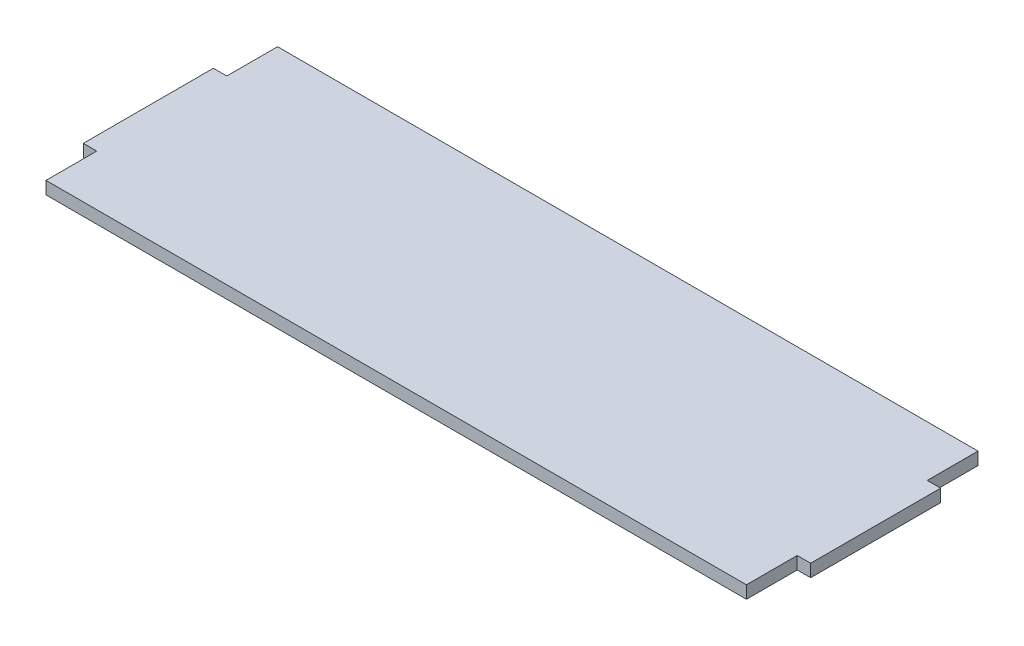
ISO-10303-21;
HEADER;
FILE_DESCRIPTION(('STEP AP214'),'2;1');
FILE_NAME('part.step','',(''),(''),'','','');
FILE_SCHEMA(('AUTOMOTIVE_DESIGN { 1 0 10303 214 1 1 1 1 }'));
ENDSEC;
DATA;
#1=APPLICATION_CONTEXT('core data for automotive mechanical design processes');
#2=APPLICATION_PROTOCOL_DEFINITION('international standard','automotive_design',2000,#1);
#3=PRODUCT_CONTEXT('',#1,'mechanical');
#4=PRODUCT('Part','Part','',(#3));
#5=PRODUCT_RELATED_PRODUCT_CATEGORY('part','',(#4));
#6=PRODUCT_DEFINITION_FORMATION('','',#4);
#7=PRODUCT_DEFINITION_CONTEXT('part definition',#1,'design');
#8=PRODUCT_DEFINITION('design','',#6,#7);
#9=PRODUCT_DEFINITION_SHAPE('','',#8);
#10=(LENGTH_UNIT() NAMED_UNIT(*) SI_UNIT(.MILLI.,.METRE.));
#11=(NAMED_UNIT(*) PLANE_ANGLE_UNIT() SI_UNIT($,.RADIAN.));
#12=(NAMED_UNIT(*) SI_UNIT($,.STERADIAN.) SOLID_ANGLE_UNIT());
#13=UNCERTAINTY_MEASURE_WITH_UNIT(LENGTH_MEASURE(1.E-05),#10,'distance_accuracy_value','');
#14=(GEOMETRIC_REPRESENTATION_CONTEXT(3) GLOBAL_UNCERTAINTY_ASSIGNED_CONTEXT((#13)) GLOBAL_UNIT_ASSIGNED_CONTEXT((#10,
#11,#12)) REPRESENTATION_CONTEXT('',''));
#15=CARTESIAN_POINT('',(0.,0.,0.));
#16=DIRECTION('',(0.,0.,1.));
#17=DIRECTION('',(1.,0.,0.));
#18=AXIS2_PLACEMENT_3D('',#15,#16,#17);
#19=CARTESIAN_POINT('',(-520.4714,234.892997883358,228.4222));
#20=DIRECTION('',(-1.,0.,0.));
#21=DIRECTION('',(0.,0.,1.));
#22=AXIS2_PLACEMENT_3D('',#19,#20,#21);
#23=PLANE('',#22);
#24=DIRECTION('',(0.,0.,-1.));
#25=VECTOR('',#24,1.);
#26=CARTESIAN_POINT('',(-520.4714,3.81000000000001,228.4222));
#27=LINE('',#26,#25);
#28=CARTESIAN_POINT('',(-520.4714,3.81000000000001,243.7892));
#29=VERTEX_POINT('',#28);
#30=CARTESIAN_POINT('',(-520.4714,3.81000000000006,228.4222));
#31=VERTEX_POINT('',#30);
#32=EDGE_CURVE('E170',#29,#31,#27,.T.);
#33=ORIENTED_EDGE('',*,*,#32,.F.);
#34=DIRECTION('',(0.,-1.,0.));
#35=VECTOR('',#34,1.);
#36=CARTESIAN_POINT('',(-520.4714,234.892997883358,243.7892));
#37=LINE('',#36,#35);
#38=CARTESIAN_POINT('',(-520.4714,0.,243.7892));
#39=VERTEX_POINT('',#38);
#40=EDGE_CURVE('E39',#29,#39,#37,.T.);
#41=ORIENTED_EDGE('',*,*,#40,.T.);
#42=DIRECTION('',(0.,0.,-1.));
#43=VECTOR('',#42,1.);
#44=CARTESIAN_POINT('',(-520.4714,0.,228.4222));
#45=LINE('',#44,#43);
#46=CARTESIAN_POINT('',(-520.4714,0.,228.4222));
#47=VERTEX_POINT('',#46);
#48=EDGE_CURVE('E178',#39,#47,#45,.T.);
#49=ORIENTED_EDGE('',*,*,#48,.T.);
#50=DIRECTION('',(0.,-1.,0.));
#51=VECTOR('',#50,1.);
#52=CARTESIAN_POINT('',(-520.4714,234.892997883358,228.4222));
#53=LINE('',#52,#51);
#54=EDGE_CURVE('E106',#31,#47,#53,.T.);
#55=ORIENTED_EDGE('',*,*,#54,.F.);
#56=EDGE_LOOP('',(#33,#41,#49,#55));
#57=FACE_BOUND('',#56,.T.);
#58=ADVANCED_FACE('F35',(#57),#23,.F.);
#59=CARTESIAN_POINT('',(-516.4074,234.892997883358,228.4222));
#60=DIRECTION('',(0.,0.,-1.));
#61=DIRECTION('',(-1.,0.,0.));
#62=AXIS2_PLACEMENT_3D('',#59,#60,#61);
#63=PLANE('',#62);
#64=DIRECTION('',(1.,0.,0.));
#65=VECTOR('',#64,1.);
#66=CARTESIAN_POINT('',(-516.4074,3.81000000000001,228.4222));
#67=LINE('',#66,#65);
#68=CARTESIAN_POINT('',(-516.4074,3.81000000000006,228.4222));
#69=VERTEX_POINT('',#68);
#70=EDGE_CURVE('E113',#31,#69,#67,.T.);
#71=ORIENTED_EDGE('',*,*,#70,.F.);
#72=ORIENTED_EDGE('',*,*,#54,.T.);
#73=DIRECTION('',(1.,0.,0.));
#74=VECTOR('',#73,1.);
#75=CARTESIAN_POINT('',(-516.4074,0.,228.4222));
#76=LINE('',#75,#74);
#77=CARTESIAN_POINT('',(-516.4074,0.,228.4222));
#78=VERTEX_POINT('',#77);
#79=EDGE_CURVE('E177',#47,#78,#76,.T.);
#80=ORIENTED_EDGE('',*,*,#79,.T.);
#81=DIRECTION('',(0.,-1.,0.));
#82=VECTOR('',#81,1.);
#83=CARTESIAN_POINT('',(-516.4074,234.892997883358,228.4222));
#84=LINE('',#83,#82);
#85=EDGE_CURVE('E179',#69,#78,#84,.T.);
#86=ORIENTED_EDGE('',*,*,#85,.F.);
#87=EDGE_LOOP('',(#71,#72,#80,#86));
#88=FACE_BOUND('',#87,.T.);
#89=ADVANCED_FACE('F228',(#88),#63,.F.);
#90=CARTESIAN_POINT('',(-516.4074,234.892997883358,189.0522));
#91=DIRECTION('',(-1.,0.,0.));
#92=DIRECTION('',(0.,0.,1.));
#93=AXIS2_PLACEMENT_3D('',#90,#91,#92);
#94=PLANE('',#93);
#95=DIRECTION('',(0.,0.,-1.));
#96=VECTOR('',#95,1.);
#97=CARTESIAN_POINT('',(-516.4074,3.81000000000001,189.0522));
#98=LINE('',#97,#96);
#99=CARTESIAN_POINT('',(-516.4074,3.81000000000006,189.0522));
#100=VERTEX_POINT('',#99);
#101=EDGE_CURVE('E166',#69,#100,#98,.T.);
#102=ORIENTED_EDGE('',*,*,#101,.F.);
#103=ORIENTED_EDGE('',*,*,#85,.T.);
#104=DIRECTION('',(0.,0.,-1.));
#105=VECTOR('',#104,1.);
#106=CARTESIAN_POINT('',(-516.4074,0.,189.0522));
#107=LINE('',#106,#105);
#108=CARTESIAN_POINT('',(-516.4074,0.,189.0522));
#109=VERTEX_POINT('',#108);
#110=EDGE_CURVE('E181',#78,#109,#107,.T.);
#111=ORIENTED_EDGE('',*,*,#110,.T.);
#112=DIRECTION('',(0.,-1.,0.));
#113=VECTOR('',#112,1.);
#114=CARTESIAN_POINT('',(-516.4074,234.892997883358,189.0522));
#115=LINE('',#114,#113);
#116=EDGE_CURVE('E182',#100,#109,#115,.T.);
#117=ORIENTED_EDGE('',*,*,#116,.F.);
#118=EDGE_LOOP('',(#102,#103,#111,#117));
#119=FACE_BOUND('',#118,.T.);
#120=ADVANCED_FACE('F231',(#119),#94,.F.);
#121=CARTESIAN_POINT('',(-520.4714,234.892997883358,189.0522));
#122=DIRECTION('',(0.,0.,1.));
#123=DIRECTION('',(1.,0.,0.));
#124=AXIS2_PLACEMENT_3D('',#121,#122,#123);
#125=PLANE('',#124);
#126=DIRECTION('',(-1.,0.,0.));
#127=VECTOR('',#126,1.);
#128=CARTESIAN_POINT('',(-520.4714,3.81000000000001,189.0522));
#129=LINE('',#128,#127);
#130=CARTESIAN_POINT('',(-520.4714,3.81000000000006,189.0522));
#131=VERTEX_POINT('',#130);
#132=EDGE_CURVE('E163',#100,#131,#129,.T.);
#133=ORIENTED_EDGE('',*,*,#132,.F.);
#134=ORIENTED_EDGE('',*,*,#116,.T.);
#135=DIRECTION('',(-1.,0.,0.));
#136=VECTOR('',#135,1.);
#137=CARTESIAN_POINT('',(-520.4714,0.,189.0522));
#138=LINE('',#137,#136);
#139=CARTESIAN_POINT('',(-520.4714,0.,189.0522));
#140=VERTEX_POINT('',#139);
#141=EDGE_CURVE('E184',#109,#140,#138,.T.);
#142=ORIENTED_EDGE('',*,*,#141,.T.);
#143=DIRECTION('',(0.,-1.,0.));
#144=VECTOR('',#143,1.);
#145=CARTESIAN_POINT('',(-520.4714,234.892997883358,189.0522));
#146=LINE('',#145,#144);
#147=EDGE_CURVE('E185',#131,#140,#146,.T.);
#148=ORIENTED_EDGE('',*,*,#147,.F.);
#149=EDGE_LOOP('',(#133,#134,#142,#148));
#150=FACE_BOUND('',#149,.T.);
#151=ADVANCED_FACE('F233',(#150),#125,.F.);
#152=CARTESIAN_POINT('',(-520.4714,234.892997883358,173.6852));
#153=DIRECTION('',(-1.,0.,0.));
#154=DIRECTION('',(0.,0.,1.));
#155=AXIS2_PLACEMENT_3D('',#152,#153,#154);
#156=PLANE('',#155);
#157=DIRECTION('',(0.,0.,-1.));
#158=VECTOR('',#157,1.);
#159=CARTESIAN_POINT('',(-520.4714,3.81000000000001,173.6852));
#160=LINE('',#159,#158);
#161=CARTESIAN_POINT('',(-520.4714,3.81000000000006,173.6852));
#162=VERTEX_POINT('',#161);
#163=EDGE_CURVE('E160',#131,#162,#160,.T.);
#164=ORIENTED_EDGE('',*,*,#163,.F.);
#165=ORIENTED_EDGE('',*,*,#147,.T.);
#166=DIRECTION('',(0.,0.,-1.));
#167=VECTOR('',#166,1.);
#168=CARTESIAN_POINT('',(-520.4714,0.,173.6852));
#169=LINE('',#168,#167);
#170=CARTESIAN_POINT('',(-520.4714,0.,173.6852));
#171=VERTEX_POINT('',#170);
#172=EDGE_CURVE('E187',#140,#171,#169,.T.);
#173=ORIENTED_EDGE('',*,*,#172,.T.);
#174=DIRECTION('',(0.,-1.,0.));
#175=VECTOR('',#174,1.);
#176=CARTESIAN_POINT('',(-520.4714,234.892997883358,173.6852));
#177=LINE('',#176,#175);
#178=EDGE_CURVE('E188',#162,#171,#177,.T.);
#179=ORIENTED_EDGE('',*,*,#178,.F.);
#180=EDGE_LOOP('',(#164,#165,#173,#179));
#181=FACE_BOUND('',#180,.T.);
#182=ADVANCED_FACE('F237',(#181),#156,.F.);
#183=CARTESIAN_POINT('',(-732.536,234.892997883358,173.6852));
#184=DIRECTION('',(0.,0.,1.));
#185=DIRECTION('',(1.,0.,0.));
#186=AXIS2_PLACEMENT_3D('',#183,#184,#185);
#187=PLANE('',#186);
#188=DIRECTION('',(-1.,0.,0.));
#189=VECTOR('',#188,1.);
#190=CARTESIAN_POINT('',(-732.536,3.81000000000001,173.6852));
#191=LINE('',#190,#189);
#192=CARTESIAN_POINT('',(-732.536,3.81000000000006,173.6852));
#193=VERTEX_POINT('',#192);
#194=EDGE_CURVE('E157',#162,#193,#191,.T.);
#195=ORIENTED_EDGE('',*,*,#194,.F.);
#196=ORIENTED_EDGE('',*,*,#178,.T.);
#197=DIRECTION('',(-1.,0.,0.));
#198=VECTOR('',#197,1.);
#199=CARTESIAN_POINT('',(-732.536,0.,173.6852));
#200=LINE('',#199,#198);
#201=CARTESIAN_POINT('',(-732.536,0.,173.6852));
#202=VERTEX_POINT('',#201);
#203=EDGE_CURVE('E190',#171,#202,#200,.T.);
#204=ORIENTED_EDGE('',*,*,#203,.T.);
#205=DIRECTION('',(0.,-1.,0.));
#206=VECTOR('',#205,1.);
#207=CARTESIAN_POINT('',(-732.536,234.892997883358,173.6852));
#208=LINE('',#207,#206);
#209=EDGE_CURVE('E191',#193,#202,#208,.T.);
#210=ORIENTED_EDGE('',*,*,#209,.F.);
#211=EDGE_LOOP('',(#195,#196,#204,#210));
#212=FACE_BOUND('',#211,.T.);
#213=ADVANCED_FACE('F242',(#212),#187,.F.);
#214=CARTESIAN_POINT('',(-732.536,234.892997883358,173.6852));
#215=DIRECTION('',(1.,0.,0.));
#216=DIRECTION('',(0.,0.,-1.));
#217=AXIS2_PLACEMENT_3D('',#214,#215,#216);
#218=PLANE('',#217);
#219=DIRECTION('',(0.,0.,1.));
#220=VECTOR('',#219,1.);
#221=CARTESIAN_POINT('',(-732.536,3.81000000000001,173.6852));
#222=LINE('',#221,#220);
#223=CARTESIAN_POINT('',(-732.536,3.81000000000006,189.0522));
#224=VERTEX_POINT('',#223);
#225=EDGE_CURVE('E154',#193,#224,#222,.T.);
#226=ORIENTED_EDGE('',*,*,#225,.F.);
#227=ORIENTED_EDGE('',*,*,#209,.T.);
#228=DIRECTION('',(0.,0.,1.));
#229=VECTOR('',#228,1.);
#230=CARTESIAN_POINT('',(-732.536,0.,173.6852));
#231=LINE('',#230,#229);
#232=CARTESIAN_POINT('',(-732.536,0.,189.0522));
#233=VERTEX_POINT('',#232);
#234=EDGE_CURVE('E193',#202,#233,#231,.T.);
#235=ORIENTED_EDGE('',*,*,#234,.T.);
#236=DIRECTION('',(0.,-1.,0.));
#237=VECTOR('',#236,1.);
#238=CARTESIAN_POINT('',(-732.536,234.892997883358,189.0522));
#239=LINE('',#238,#237);
#240=EDGE_CURVE('E194',#224,#233,#239,.T.);
#241=ORIENTED_EDGE('',*,*,#240,.F.);
#242=EDGE_LOOP('',(#226,#227,#235,#241));
#243=FACE_BOUND('',#242,.T.);
#244=ADVANCED_FACE('F245',(#243),#218,.F.);
#245=CARTESIAN_POINT('',(-732.536,234.892997883358,189.0522));
#246=DIRECTION('',(0.,0.,1.));
#247=DIRECTION('',(1.,0.,0.));
#248=AXIS2_PLACEMENT_3D('',#245,#246,#247);
#249=PLANE('',#248);
#250=DIRECTION('',(-1.,0.,0.));
#251=VECTOR('',#250,1.);
#252=CARTESIAN_POINT('',(-732.536,3.81000000000001,189.0522));
#253=LINE('',#252,#251);
#254=CARTESIAN_POINT('',(-736.6,3.81000000000006,189.0522));
#255=VERTEX_POINT('',#254);
#256=EDGE_CURVE('E149',#224,#255,#253,.T.);
#257=ORIENTED_EDGE('',*,*,#256,.F.);
#258=ORIENTED_EDGE('',*,*,#240,.T.);
#259=DIRECTION('',(-1.,0.,0.));
#260=VECTOR('',#259,1.);
#261=CARTESIAN_POINT('',(-732.536,0.,189.0522));
#262=LINE('',#261,#260);
#263=CARTESIAN_POINT('',(-736.6,0.,189.0522));
#264=VERTEX_POINT('',#263);
#265=EDGE_CURVE('E196',#233,#264,#262,.T.);
#266=ORIENTED_EDGE('',*,*,#265,.T.);
#267=DIRECTION('',(0.,-1.,0.));
#268=VECTOR('',#267,1.);
#269=CARTESIAN_POINT('',(-736.6,234.892997883358,189.0522));
#270=LINE('',#269,#268);
#271=EDGE_CURVE('E197',#255,#264,#270,.T.);
#272=ORIENTED_EDGE('',*,*,#271,.F.);
#273=EDGE_LOOP('',(#257,#258,#266,#272));
#274=FACE_BOUND('',#273,.T.);
#275=ADVANCED_FACE('F249',(#274),#249,.F.);
#276=CARTESIAN_POINT('',(-736.6,234.892997883358,189.0522));
#277=DIRECTION('',(1.,0.,0.));
#278=DIRECTION('',(0.,0.,-1.));
#279=AXIS2_PLACEMENT_3D('',#276,#277,#278);
#280=PLANE('',#279);
#281=DIRECTION('',(0.,0.,1.));
#282=VECTOR('',#281,1.);
#283=CARTESIAN_POINT('',(-736.6,3.81000000000001,189.0522));
#284=LINE('',#283,#282);
#285=CARTESIAN_POINT('',(-736.6,3.81000000000006,228.4222));
#286=VERTEX_POINT('',#285);
#287=EDGE_CURVE('E147',#255,#286,#284,.T.);
#288=ORIENTED_EDGE('',*,*,#287,.F.);
#289=ORIENTED_EDGE('',*,*,#271,.T.);
#290=DIRECTION('',(0.,0.,1.));
#291=VECTOR('',#290,1.);
#292=CARTESIAN_POINT('',(-736.6,0.,189.0522));
#293=LINE('',#292,#291);
#294=CARTESIAN_POINT('',(-736.6,0.,228.4222));
#295=VERTEX_POINT('',#294);
#296=EDGE_CURVE('E199',#264,#295,#293,.T.);
#297=ORIENTED_EDGE('',*,*,#296,.T.);
#298=DIRECTION('',(0.,-1.,0.));
#299=VECTOR('',#298,1.);
#300=CARTESIAN_POINT('',(-736.6,234.892997883358,228.4222));
#301=LINE('',#300,#299);
#302=EDGE_CURVE('E200',#286,#295,#301,.T.);
#303=ORIENTED_EDGE('',*,*,#302,.F.);
#304=EDGE_LOOP('',(#288,#289,#297,#303));
#305=FACE_BOUND('',#304,.T.);
#306=ADVANCED_FACE('F253',(#305),#280,.F.);
#307=CARTESIAN_POINT('',(-736.6,234.892997883358,228.4222));
#308=DIRECTION('',(0.,0.,-1.));
#309=DIRECTION('',(-1.,0.,0.));
#310=AXIS2_PLACEMENT_3D('',#307,#308,#309);
#311=PLANE('',#310);
#312=DIRECTION('',(1.,0.,0.));
#313=VECTOR('',#312,1.);
#314=CARTESIAN_POINT('',(-736.6,3.81000000000001,228.4222));
#315=LINE('',#314,#313);
#316=CARTESIAN_POINT('',(-732.536,3.81000000000006,228.4222));
#317=VERTEX_POINT('',#316);
#318=EDGE_CURVE('E44',#286,#317,#315,.T.);
#319=ORIENTED_EDGE('',*,*,#318,.F.);
#320=ORIENTED_EDGE('',*,*,#302,.T.);
#321=DIRECTION('',(1.,0.,0.));
#322=VECTOR('',#321,1.);
#323=CARTESIAN_POINT('',(-736.6,0.,228.4222));
#324=LINE('',#323,#322);
#325=CARTESIAN_POINT('',(-732.536,0.,228.4222));
#326=VERTEX_POINT('',#325);
#327=EDGE_CURVE('E141',#295,#326,#324,.T.);
#328=ORIENTED_EDGE('',*,*,#327,.T.);
#329=DIRECTION('',(0.,-1.,0.));
#330=VECTOR('',#329,1.);
#331=CARTESIAN_POINT('',(-732.536,234.892997883358,228.4222));
#332=LINE('',#331,#330);
#333=EDGE_CURVE('E132',#317,#326,#332,.T.);
#334=ORIENTED_EDGE('',*,*,#333,.F.);
#335=EDGE_LOOP('',(#319,#320,#328,#334));
#336=FACE_BOUND('',#335,.T.);
#337=ADVANCED_FACE('F138',(#336),#311,.F.);
#338=CARTESIAN_POINT('',(-732.536,234.892997883358,228.4222));
#339=DIRECTION('',(1.,0.,0.));
#340=DIRECTION('',(0.,0.,-1.));
#341=AXIS2_PLACEMENT_3D('',#338,#339,#340);
#342=PLANE('',#341);
#343=DIRECTION('',(0.,0.,1.));
#344=VECTOR('',#343,1.);
#345=CARTESIAN_POINT('',(-732.536,3.81000000000001,228.4222));
#346=LINE('',#345,#344);
#347=CARTESIAN_POINT('',(-732.536,3.81000000000006,243.7892));
#348=VERTEX_POINT('',#347);
#349=EDGE_CURVE('E11',#317,#348,#346,.T.);
#350=ORIENTED_EDGE('',*,*,#349,.F.);
#351=ORIENTED_EDGE('',*,*,#333,.T.);
#352=DIRECTION('',(0.,0.,1.));
#353=VECTOR('',#352,1.);
#354=CARTESIAN_POINT('',(-732.536,0.,228.4222));
#355=LINE('',#354,#353);
#356=CARTESIAN_POINT('',(-732.536,0.,243.7892));
#357=VERTEX_POINT('',#356);
#358=EDGE_CURVE('E143',#326,#357,#355,.T.);
#359=ORIENTED_EDGE('',*,*,#358,.T.);
#360=DIRECTION('',(0.,-1.,0.));
#361=VECTOR('',#360,1.);
#362=CARTESIAN_POINT('',(-732.536,234.892997883358,243.7892));
#363=LINE('',#362,#361);
#364=EDGE_CURVE('E57',#348,#357,#363,.T.);
#365=ORIENTED_EDGE('',*,*,#364,.F.);
#366=EDGE_LOOP('',(#350,#351,#359,#365));
#367=FACE_BOUND('',#366,.T.);
#368=ADVANCED_FACE('F131',(#367),#342,.F.);
#369=CARTESIAN_POINT('',(-732.536,234.892997883358,243.7892));
#370=DIRECTION('',(0.,0.,-1.));
#371=DIRECTION('',(-1.,0.,0.));
#372=AXIS2_PLACEMENT_3D('',#369,#370,#371);
#373=PLANE('',#372);
#374=DIRECTION('',(1.,0.,0.));
#375=VECTOR('',#374,1.);
#376=CARTESIAN_POINT('',(-732.536,3.81000000000001,243.7892));
#377=LINE('',#376,#375);
#378=EDGE_CURVE('E173',#348,#29,#377,.T.);
#379=ORIENTED_EDGE('',*,*,#378,.F.);
#380=ORIENTED_EDGE('',*,*,#364,.T.);
#381=DIRECTION('',(1.,0.,0.));
#382=VECTOR('',#381,1.);
#383=CARTESIAN_POINT('',(-732.536,0.,243.7892));
#384=LINE('',#383,#382);
#385=EDGE_CURVE('E175',#357,#39,#384,.T.);
#386=ORIENTED_EDGE('',*,*,#385,.T.);
#387=ORIENTED_EDGE('',*,*,#40,.F.);
#388=EDGE_LOOP('',(#379,#380,#386,#387));
#389=FACE_BOUND('',#388,.T.);
#390=ADVANCED_FACE('F223',(#389),#373,.F.);
#391=CARTESIAN_POINT('',(0.,0.,0.));
#392=DIRECTION('',(0.,1.,0.));
#393=DIRECTION('',(0.,0.,1.));
#394=AXIS2_PLACEMENT_3D('',#391,#392,#393);
#395=PLANE('',#394);
#396=ORIENTED_EDGE('',*,*,#48,.F.);
#397=ORIENTED_EDGE('',*,*,#385,.F.);
#398=ORIENTED_EDGE('',*,*,#358,.F.);
#399=ORIENTED_EDGE('',*,*,#327,.F.);
#400=ORIENTED_EDGE('',*,*,#296,.F.);
#401=ORIENTED_EDGE('',*,*,#265,.F.);
#402=ORIENTED_EDGE('',*,*,#234,.F.);
#403=ORIENTED_EDGE('',*,*,#203,.F.);
#404=ORIENTED_EDGE('',*,*,#172,.F.);
#405=ORIENTED_EDGE('',*,*,#141,.F.);
#406=ORIENTED_EDGE('',*,*,#110,.F.);
#407=ORIENTED_EDGE('',*,*,#79,.F.);
#408=EDGE_LOOP('',(#396,#397,#398,#399,#400,#401,#402,#403,#404,#405,#406,#407));
#409=FACE_BOUND('',#408,.T.);
#410=ADVANCED_FACE('F225',(#409),#395,.F.);
#411=CARTESIAN_POINT('',(0.,3.81,0.));
#412=DIRECTION('',(0.,1.,0.));
#413=DIRECTION('',(0.,0.,1.));
#414=AXIS2_PLACEMENT_3D('',#411,#412,#413);
#415=PLANE('',#414);
#416=ORIENTED_EDGE('',*,*,#378,.T.);
#417=ORIENTED_EDGE('',*,*,#32,.T.);
#418=ORIENTED_EDGE('',*,*,#70,.T.);
#419=ORIENTED_EDGE('',*,*,#101,.T.);
#420=ORIENTED_EDGE('',*,*,#132,.T.);
#421=ORIENTED_EDGE('',*,*,#163,.T.);
#422=ORIENTED_EDGE('',*,*,#194,.T.);
#423=ORIENTED_EDGE('',*,*,#225,.T.);
#424=ORIENTED_EDGE('',*,*,#256,.T.);
#425=ORIENTED_EDGE('',*,*,#287,.T.);
#426=ORIENTED_EDGE('',*,*,#318,.T.);
#427=ORIENTED_EDGE('',*,*,#349,.T.);
#428=EDGE_LOOP('',(#416,#417,#418,#419,#420,#421,#422,#423,#424,#425,#426,#427));
#429=FACE_BOUND('',#428,.T.);
#430=ADVANCED_FACE('F37',(#429),#415,.T.);
#431=CLOSED_SHELL('',(#58,#89,#120,#151,#182,#213,#244,#275,#306,#337,#368,#390,#410,#430));
#432=MANIFOLD_SOLID_BREP('B2',#431);
#433=ADVANCED_BREP_SHAPE_REPRESENTATION('',(#18,#432),#14);
#434=SHAPE_DEFINITION_REPRESENTATION(#9,#433);
ENDSEC;
END-ISO-10303-21;
